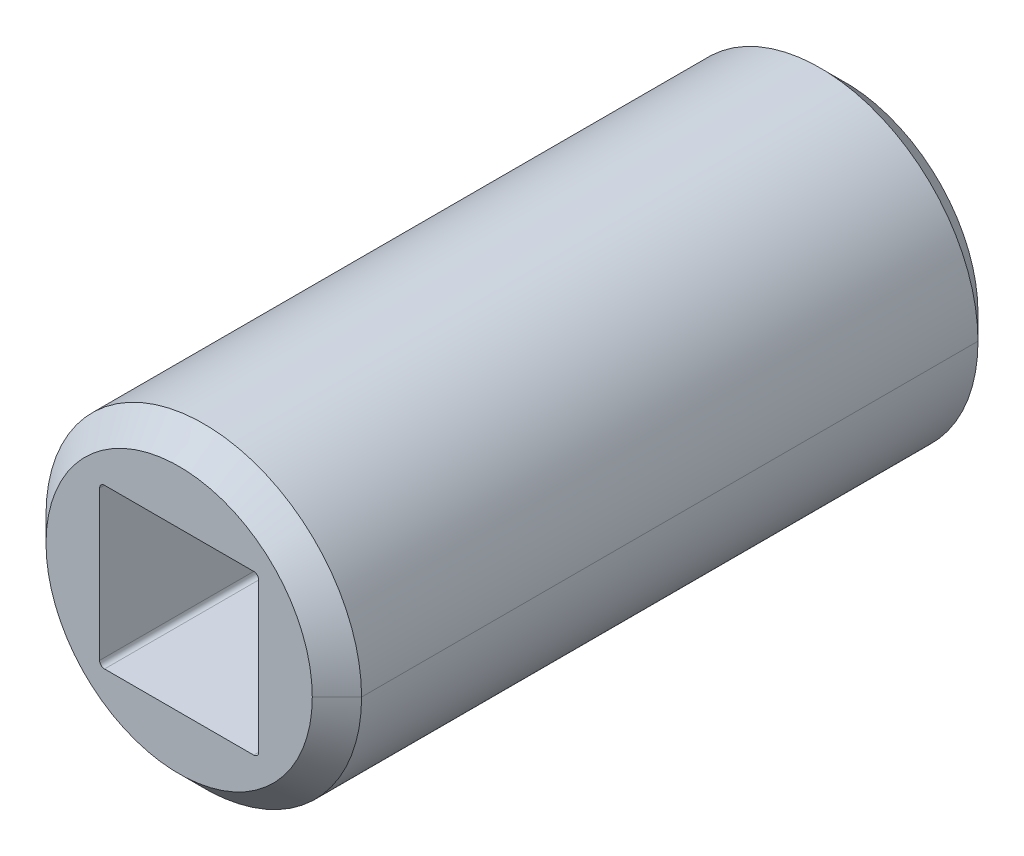
ISO-10303-21;
HEADER;
FILE_DESCRIPTION(('STEP AP214'),'2;1');
FILE_NAME('part.step','',(''),(''),'','','');
FILE_SCHEMA(('AUTOMOTIVE_DESIGN { 1 0 10303 214 1 1 1 1 }'));
ENDSEC;
DATA;
#1=APPLICATION_CONTEXT('core data for automotive mechanical design processes');
#2=APPLICATION_PROTOCOL_DEFINITION('international standard','automotive_design',2000,#1);
#3=PRODUCT_CONTEXT('',#1,'mechanical');
#4=PRODUCT('Part','Part','',(#3));
#5=PRODUCT_RELATED_PRODUCT_CATEGORY('part','',(#4));
#6=PRODUCT_DEFINITION_FORMATION('','',#4);
#7=PRODUCT_DEFINITION_CONTEXT('part definition',#1,'design');
#8=PRODUCT_DEFINITION('design','',#6,#7);
#9=PRODUCT_DEFINITION_SHAPE('','',#8);
#10=(LENGTH_UNIT() NAMED_UNIT(*) SI_UNIT(.MILLI.,.METRE.));
#11=(NAMED_UNIT(*) PLANE_ANGLE_UNIT() SI_UNIT($,.RADIAN.));
#12=(NAMED_UNIT(*) SI_UNIT($,.STERADIAN.) SOLID_ANGLE_UNIT());
#13=UNCERTAINTY_MEASURE_WITH_UNIT(LENGTH_MEASURE(1.E-05),#10,'distance_accuracy_value','');
#14=(GEOMETRIC_REPRESENTATION_CONTEXT(3) GLOBAL_UNCERTAINTY_ASSIGNED_CONTEXT((#13)) GLOBAL_UNIT_ASSIGNED_CONTEXT((#10,
#11,#12)) REPRESENTATION_CONTEXT('',''));
#15=CARTESIAN_POINT('',(0.,0.,0.));
#16=DIRECTION('',(0.,0.,1.));
#17=DIRECTION('',(1.,0.,0.));
#18=AXIS2_PLACEMENT_3D('',#15,#16,#17);
#19=CARTESIAN_POINT('',(0.,0.,6.75));
#20=DIRECTION('',(0.,0.,-1.));
#21=DIRECTION('',(-1.,0.,0.));
#22=AXIS2_PLACEMENT_3D('',#19,#20,#21);
#23=CONICAL_SURFACE('',#22,2.7,0.785398163397446);
#24=CARTESIAN_POINT('',(0.,0.,6.75));
#25=DIRECTION('',(0.,0.,1.));
#26=DIRECTION('',(1.,0.,0.));
#27=AXIS2_PLACEMENT_3D('',#24,#25,#26);
#28=CIRCLE('',#27,2.7);
#29=CARTESIAN_POINT('',(2.7,0.,6.75));
#30=VERTEX_POINT('',#29);
#31=CARTESIAN_POINT('',(-2.7,0.,6.75));
#32=VERTEX_POINT('',#31);
#33=EDGE_CURVE('E41',#30,#32,#28,.T.);
#34=ORIENTED_EDGE('',*,*,#33,.F.);
#35=DIRECTION('',(0.707106781186546,0.,-0.707106781186549));
#36=VECTOR('',#35,1.);
#37=CARTESIAN_POINT('',(2.7,0.,6.75));
#38=LINE('',#37,#36);
#39=CARTESIAN_POINT('',(3.2,0.,6.25));
#40=VERTEX_POINT('',#39);
#41=EDGE_CURVE('E10',#30,#40,#38,.T.);
#42=ORIENTED_EDGE('',*,*,#41,.T.);
#43=CARTESIAN_POINT('',(0.,0.,6.25));
#44=DIRECTION('',(0.,0.,-1.));
#45=DIRECTION('',(1.,0.,0.));
#46=AXIS2_PLACEMENT_3D('',#43,#44,#45);
#47=CIRCLE('',#46,3.2);
#48=CARTESIAN_POINT('',(-3.2,0.,6.25));
#49=VERTEX_POINT('',#48);
#50=EDGE_CURVE('E283',#49,#40,#47,.T.);
#51=ORIENTED_EDGE('',*,*,#50,.F.);
#52=DIRECTION('',(-0.707106781186546,0.,-0.707106781186549));
#53=VECTOR('',#52,1.);
#54=CARTESIAN_POINT('',(-2.7,0.,6.75));
#55=LINE('',#54,#53);
#56=EDGE_CURVE('E360',#32,#49,#55,.T.);
#57=ORIENTED_EDGE('',*,*,#56,.F.);
#58=EDGE_LOOP('',(#34,#42,#51,#57));
#59=FACE_BOUND('',#58,.T.);
#60=ADVANCED_FACE('F16',(#59),#23,.T.);
#61=CARTESIAN_POINT('',(0.,0.,-6.25));
#62=DIRECTION('',(0.,0.,1.));
#63=DIRECTION('',(1.,0.,0.));
#64=AXIS2_PLACEMENT_3D('',#61,#62,#63);
#65=CONICAL_SURFACE('',#64,3.2,0.78539816339745);
#66=CARTESIAN_POINT('',(0.,0.,-6.75));
#67=DIRECTION('',(0.,0.,-1.));
#68=DIRECTION('',(1.,0.,0.));
#69=AXIS2_PLACEMENT_3D('',#66,#67,#68);
#70=CIRCLE('',#69,2.7);
#71=CARTESIAN_POINT('',(-2.7,0.,-6.75));
#72=VERTEX_POINT('',#71);
#73=CARTESIAN_POINT('',(2.7,0.,-6.75));
#74=VERTEX_POINT('',#73);
#75=EDGE_CURVE('E254',#72,#74,#70,.T.);
#76=ORIENTED_EDGE('',*,*,#75,.F.);
#77=DIRECTION('',(-0.707106781186549,0.,0.707106781186546));
#78=VECTOR('',#77,1.);
#79=CARTESIAN_POINT('',(-3.2,0.,-6.25));
#80=LINE('',#79,#78);
#81=CARTESIAN_POINT('',(-3.2,0.,-6.25));
#82=VERTEX_POINT('',#81);
#83=EDGE_CURVE('E30',#72,#82,#80,.T.);
#84=ORIENTED_EDGE('',*,*,#83,.T.);
#85=CARTESIAN_POINT('',(0.,0.,-6.25));
#86=DIRECTION('',(0.,0.,1.));
#87=DIRECTION('',(1.,0.,0.));
#88=AXIS2_PLACEMENT_3D('',#85,#86,#87);
#89=CIRCLE('',#88,3.2);
#90=CARTESIAN_POINT('',(3.2,0.,-6.25));
#91=VERTEX_POINT('',#90);
#92=EDGE_CURVE('E285',#91,#82,#89,.T.);
#93=ORIENTED_EDGE('',*,*,#92,.F.);
#94=DIRECTION('',(0.707106781186549,0.,0.707106781186546));
#95=VECTOR('',#94,1.);
#96=CARTESIAN_POINT('',(3.2,0.,-6.25));
#97=LINE('',#96,#95);
#98=EDGE_CURVE('E352',#74,#91,#97,.T.);
#99=ORIENTED_EDGE('',*,*,#98,.F.);
#100=EDGE_LOOP('',(#76,#84,#93,#99));
#101=FACE_BOUND('',#100,.T.);
#102=ADVANCED_FACE('F849',(#101),#65,.T.);
#103=CARTESIAN_POINT('',(0.,0.,6.75));
#104=DIRECTION('',(0.,0.,-1.));
#105=DIRECTION('',(-1.,0.,0.));
#106=AXIS2_PLACEMENT_3D('',#103,#104,#105);
#107=CYLINDRICAL_SURFACE('',#106,3.2);
#108=ORIENTED_EDGE('',*,*,#50,.T.);
#109=DIRECTION('',(0.,0.,-1.));
#110=VECTOR('',#109,1.);
#111=CARTESIAN_POINT('',(3.2,0.,6.75));
#112=LINE('',#111,#110);
#113=EDGE_CURVE('E287',#40,#91,#112,.T.);
#114=ORIENTED_EDGE('',*,*,#113,.T.);
#115=ORIENTED_EDGE('',*,*,#92,.T.);
#116=DIRECTION('',(0.,0.,-1.));
#117=VECTOR('',#116,1.);
#118=CARTESIAN_POINT('',(-3.2,0.,6.75));
#119=LINE('',#118,#117);
#120=EDGE_CURVE('E298',#49,#82,#119,.T.);
#121=ORIENTED_EDGE('',*,*,#120,.F.);
#122=EDGE_LOOP('',(#108,#114,#115,#121));
#123=FACE_BOUND('',#122,.T.);
#124=ADVANCED_FACE('F846',(#123),#107,.T.);
#125=CARTESIAN_POINT('',(0.,0.,6.75));
#126=DIRECTION('',(0.,0.,-1.));
#127=DIRECTION('',(-1.,0.,0.));
#128=AXIS2_PLACEMENT_3D('',#125,#126,#127);
#129=CYLINDRICAL_SURFACE('',#128,1.5875);
#130=CARTESIAN_POINT('',(0.,0.,1.));
#131=DIRECTION('',(0.,0.,1.));
#132=DIRECTION('',(1.,0.,0.));
#133=AXIS2_PLACEMENT_3D('',#130,#131,#132);
#134=CIRCLE('',#133,1.5875);
#135=CARTESIAN_POINT('',(-1.5875,0.,1.));
#136=VERTEX_POINT('',#135);
#137=CARTESIAN_POINT('',(1.5875,0.,1.));
#138=VERTEX_POINT('',#137);
#139=EDGE_CURVE('E289',#136,#138,#134,.T.);
#140=ORIENTED_EDGE('',*,*,#139,.T.);
#141=DIRECTION('',(0.,0.,-1.));
#142=VECTOR('',#141,1.);
#143=CARTESIAN_POINT('',(1.5875,0.,6.75));
#144=LINE('',#143,#142);
#145=CARTESIAN_POINT('',(1.5875,0.,-1.));
#146=VERTEX_POINT('',#145);
#147=EDGE_CURVE('E306',#138,#146,#144,.T.);
#148=ORIENTED_EDGE('',*,*,#147,.T.);
#149=CARTESIAN_POINT('',(0.,0.,-1.));
#150=DIRECTION('',(0.,0.,-1.));
#151=DIRECTION('',(-1.,0.,0.));
#152=AXIS2_PLACEMENT_3D('',#149,#150,#151);
#153=CIRCLE('',#152,1.5875);
#154=CARTESIAN_POINT('',(-1.5875,0.,-1.));
#155=VERTEX_POINT('',#154);
#156=EDGE_CURVE('E301',#146,#155,#153,.T.);
#157=ORIENTED_EDGE('',*,*,#156,.T.);
#158=DIRECTION('',(0.,0.,-1.));
#159=VECTOR('',#158,1.);
#160=CARTESIAN_POINT('',(-1.5875,0.,6.75));
#161=LINE('',#160,#159);
#162=EDGE_CURVE('E349',#136,#155,#161,.T.);
#163=ORIENTED_EDGE('',*,*,#162,.F.);
#164=EDGE_LOOP('',(#140,#148,#157,#163));
#165=FACE_BOUND('',#164,.T.);
#166=ADVANCED_FACE('F810',(#165),#129,.F.);
#167=CARTESIAN_POINT('',(0.,0.,6.75));
#168=DIRECTION('',(0.,0.,-1.));
#169=DIRECTION('',(-1.,0.,0.));
#170=AXIS2_PLACEMENT_3D('',#167,#168,#169);
#171=CYLINDRICAL_SURFACE('',#170,1.5875);
#172=ORIENTED_EDGE('',*,*,#147,.F.);
#173=CARTESIAN_POINT('',(0.,0.,1.));
#174=DIRECTION('',(0.,0.,1.));
#175=DIRECTION('',(1.,0.,0.));
#176=AXIS2_PLACEMENT_3D('',#173,#174,#175);
#177=CIRCLE('',#176,1.5875);
#178=EDGE_CURVE('E310',#138,#136,#177,.T.);
#179=ORIENTED_EDGE('',*,*,#178,.T.);
#180=ORIENTED_EDGE('',*,*,#162,.T.);
#181=CARTESIAN_POINT('',(0.,0.,-1.));
#182=DIRECTION('',(0.,0.,-1.));
#183=DIRECTION('',(-1.,0.,0.));
#184=AXIS2_PLACEMENT_3D('',#181,#182,#183);
#185=CIRCLE('',#184,1.5875);
#186=EDGE_CURVE('E294',#155,#146,#185,.T.);
#187=ORIENTED_EDGE('',*,*,#186,.T.);
#188=EDGE_LOOP('',(#172,#179,#180,#187));
#189=FACE_BOUND('',#188,.T.);
#190=ADVANCED_FACE('F802',(#189),#171,.F.);
#191=CARTESIAN_POINT('',(0.,0.,6.75));
#192=DIRECTION('',(0.,0.,1.));
#193=DIRECTION('',(1.,0.,0.));
#194=AXIS2_PLACEMENT_3D('',#191,#192,#193);
#195=PLANE('',#194);
#196=CARTESIAN_POINT('',(0.,0.,6.75));
#197=DIRECTION('',(0.,0.,1.));
#198=DIRECTION('',(1.,0.,0.));
#199=AXIS2_PLACEMENT_3D('',#196,#197,#198);
#200=CIRCLE('',#199,2.7);
#201=EDGE_CURVE('E295',#32,#30,#200,.T.);
#202=ORIENTED_EDGE('',*,*,#201,.T.);
#203=ORIENTED_EDGE('',*,*,#33,.T.);
#204=EDGE_LOOP('',(#202,#203));
#205=FACE_BOUND('',#204,.T.);
#206=DIRECTION('',(0.,1.,0.));
#207=VECTOR('',#206,1.);
#208=CARTESIAN_POINT('',(1.6129,1.6129,6.75));
#209=LINE('',#208,#207);
#210=CARTESIAN_POINT('',(1.6129,-1.5129,6.75));
#211=VERTEX_POINT('',#210);
#212=CARTESIAN_POINT('',(1.6129,1.5129,6.75));
#213=VERTEX_POINT('',#212);
#214=EDGE_CURVE('E220',#211,#213,#209,.T.);
#215=ORIENTED_EDGE('',*,*,#214,.F.);
#216=CARTESIAN_POINT('',(1.5129,-1.5129,6.75));
#217=DIRECTION('',(0.,0.,-1.));
#218=DIRECTION('',(1.,0.,0.));
#219=AXIS2_PLACEMENT_3D('',#216,#217,#218);
#220=CIRCLE('',#219,0.1);
#221=CARTESIAN_POINT('',(1.5129,-1.6129,6.75));
#222=VERTEX_POINT('',#221);
#223=EDGE_CURVE('E330',#211,#222,#220,.T.);
#224=ORIENTED_EDGE('',*,*,#223,.T.);
#225=DIRECTION('',(1.,0.,0.));
#226=VECTOR('',#225,1.);
#227=CARTESIAN_POINT('',(-1.6129,-1.6129,6.75));
#228=LINE('',#227,#226);
#229=CARTESIAN_POINT('',(-1.5129,-1.6129,6.75));
#230=VERTEX_POINT('',#229);
#231=EDGE_CURVE('E230',#230,#222,#228,.T.);
#232=ORIENTED_EDGE('',*,*,#231,.F.);
#233=CARTESIAN_POINT('',(-1.5129,-1.5129,6.75));
#234=DIRECTION('',(0.,0.,-1.));
#235=DIRECTION('',(1.,0.,0.));
#236=AXIS2_PLACEMENT_3D('',#233,#234,#235);
#237=CIRCLE('',#236,0.1);
#238=CARTESIAN_POINT('',(-1.6129,-1.5129,6.75));
#239=VERTEX_POINT('',#238);
#240=EDGE_CURVE('E416',#230,#239,#237,.T.);
#241=ORIENTED_EDGE('',*,*,#240,.T.);
#242=DIRECTION('',(0.,-1.,0.));
#243=VECTOR('',#242,1.);
#244=CARTESIAN_POINT('',(-1.6129,1.6129,6.75));
#245=LINE('',#244,#243);
#246=CARTESIAN_POINT('',(-1.6129,1.5129,6.75));
#247=VERTEX_POINT('',#246);
#248=EDGE_CURVE('E401',#247,#239,#245,.T.);
#249=ORIENTED_EDGE('',*,*,#248,.F.);
#250=CARTESIAN_POINT('',(-1.5129,1.5129,6.75));
#251=DIRECTION('',(0.,0.,-1.));
#252=DIRECTION('',(1.,0.,0.));
#253=AXIS2_PLACEMENT_3D('',#250,#251,#252);
#254=CIRCLE('',#253,0.1);
#255=CARTESIAN_POINT('',(-1.5129,1.6129,6.75));
#256=VERTEX_POINT('',#255);
#257=EDGE_CURVE('E425',#247,#256,#254,.T.);
#258=ORIENTED_EDGE('',*,*,#257,.T.);
#259=DIRECTION('',(-1.,0.,0.));
#260=VECTOR('',#259,1.);
#261=CARTESIAN_POINT('',(-1.6129,1.6129,6.75));
#262=LINE('',#261,#260);
#263=CARTESIAN_POINT('',(1.5129,1.6129,6.75));
#264=VERTEX_POINT('',#263);
#265=EDGE_CURVE('E309',#264,#256,#262,.T.);
#266=ORIENTED_EDGE('',*,*,#265,.F.);
#267=CARTESIAN_POINT('',(1.5129,1.5129,6.75));
#268=DIRECTION('',(0.,0.,-1.));
#269=DIRECTION('',(1.,0.,0.));
#270=AXIS2_PLACEMENT_3D('',#267,#268,#269);
#271=CIRCLE('',#270,0.1);
#272=EDGE_CURVE('E435',#264,#213,#271,.T.);
#273=ORIENTED_EDGE('',*,*,#272,.T.);
#274=EDGE_LOOP('',(#215,#224,#232,#241,#249,#258,#266,#273));
#275=FACE_BOUND('',#274,.T.);
#276=ADVANCED_FACE('F808',(#205,#275),#195,.T.);
#277=CARTESIAN_POINT('',(0.,0.,-6.75));
#278=DIRECTION('',(0.,0.,1.));
#279=DIRECTION('',(1.,0.,0.));
#280=AXIS2_PLACEMENT_3D('',#277,#278,#279);
#281=PLANE('',#280);
#282=CARTESIAN_POINT('',(0.,0.,-6.75));
#283=DIRECTION('',(0.,0.,-1.));
#284=DIRECTION('',(1.,0.,0.));
#285=AXIS2_PLACEMENT_3D('',#282,#283,#284);
#286=CIRCLE('',#285,2.7);
#287=EDGE_CURVE('E414',#74,#72,#286,.T.);
#288=ORIENTED_EDGE('',*,*,#287,.T.);
#289=ORIENTED_EDGE('',*,*,#75,.T.);
#290=EDGE_LOOP('',(#288,#289));
#291=FACE_BOUND('',#290,.T.);
#292=DIRECTION('',(0.,-1.,0.));
#293=VECTOR('',#292,1.);
#294=CARTESIAN_POINT('',(-1.6129,1.6129,-6.75));
#295=LINE('',#294,#293);
#296=CARTESIAN_POINT('',(-1.6129,1.5129,-6.75));
#297=VERTEX_POINT('',#296);
#298=CARTESIAN_POINT('',(-1.6129,-1.5129,-6.75));
#299=VERTEX_POINT('',#298);
#300=EDGE_CURVE('E249',#297,#299,#295,.T.);
#301=ORIENTED_EDGE('',*,*,#300,.T.);
#302=CARTESIAN_POINT('',(-1.5129,-1.5129,-6.75));
#303=DIRECTION('',(0.,0.,1.));
#304=DIRECTION('',(1.,0.,0.));
#305=AXIS2_PLACEMENT_3D('',#302,#303,#304);
#306=CIRCLE('',#305,0.1);
#307=CARTESIAN_POINT('',(-1.5129,-1.6129,-6.75));
#308=VERTEX_POINT('',#307);
#309=EDGE_CURVE('E238',#299,#308,#306,.T.);
#310=ORIENTED_EDGE('',*,*,#309,.T.);
#311=DIRECTION('',(1.,0.,0.));
#312=VECTOR('',#311,1.);
#313=CARTESIAN_POINT('',(-1.6129,-1.6129,-6.75));
#314=LINE('',#313,#312);
#315=CARTESIAN_POINT('',(1.5129,-1.6129,-6.75));
#316=VERTEX_POINT('',#315);
#317=EDGE_CURVE('E246',#308,#316,#314,.T.);
#318=ORIENTED_EDGE('',*,*,#317,.T.);
#319=CARTESIAN_POINT('',(1.5129,-1.5129,-6.75));
#320=DIRECTION('',(0.,0.,1.));
#321=DIRECTION('',(1.,0.,0.));
#322=AXIS2_PLACEMENT_3D('',#319,#320,#321);
#323=CIRCLE('',#322,0.1);
#324=CARTESIAN_POINT('',(1.6129,-1.5129,-6.75));
#325=VERTEX_POINT('',#324);
#326=EDGE_CURVE('E327',#316,#325,#323,.T.);
#327=ORIENTED_EDGE('',*,*,#326,.T.);
#328=DIRECTION('',(0.,1.,0.));
#329=VECTOR('',#328,1.);
#330=CARTESIAN_POINT('',(1.6129,1.6129,-6.75));
#331=LINE('',#330,#329);
#332=CARTESIAN_POINT('',(1.6129,1.5129,-6.75));
#333=VERTEX_POINT('',#332);
#334=EDGE_CURVE('E335',#325,#333,#331,.T.);
#335=ORIENTED_EDGE('',*,*,#334,.T.);
#336=CARTESIAN_POINT('',(1.5129,1.5129,-6.75));
#337=DIRECTION('',(0.,0.,1.));
#338=DIRECTION('',(1.,0.,0.));
#339=AXIS2_PLACEMENT_3D('',#336,#337,#338);
#340=CIRCLE('',#339,0.1);
#341=CARTESIAN_POINT('',(1.5129,1.6129,-6.75));
#342=VERTEX_POINT('',#341);
#343=EDGE_CURVE('E20',#333,#342,#340,.T.);
#344=ORIENTED_EDGE('',*,*,#343,.T.);
#345=DIRECTION('',(-1.,0.,0.));
#346=VECTOR('',#345,1.);
#347=CARTESIAN_POINT('',(-1.6129,1.6129,-6.75));
#348=LINE('',#347,#346);
#349=CARTESIAN_POINT('',(-1.5129,1.6129,-6.75));
#350=VERTEX_POINT('',#349);
#351=EDGE_CURVE('E383',#342,#350,#348,.T.);
#352=ORIENTED_EDGE('',*,*,#351,.T.);
#353=CARTESIAN_POINT('',(-1.5129,1.5129,-6.75));
#354=DIRECTION('',(0.,0.,1.));
#355=DIRECTION('',(1.,0.,0.));
#356=AXIS2_PLACEMENT_3D('',#353,#354,#355);
#357=CIRCLE('',#356,0.1);
#358=EDGE_CURVE('E130',#350,#297,#357,.T.);
#359=ORIENTED_EDGE('',*,*,#358,.T.);
#360=EDGE_LOOP('',(#301,#310,#318,#327,#335,#344,#352,#359));
#361=FACE_BOUND('',#360,.T.);
#362=ADVANCED_FACE('F253',(#291,#361),#281,.F.);
#363=CARTESIAN_POINT('',(0.,0.,6.75));
#364=DIRECTION('',(0.,0.,-1.));
#365=DIRECTION('',(-1.,0.,0.));
#366=AXIS2_PLACEMENT_3D('',#363,#364,#365);
#367=CYLINDRICAL_SURFACE('',#366,3.2);
#368=ORIENTED_EDGE('',*,*,#113,.F.);
#369=CARTESIAN_POINT('',(0.,0.,6.25));
#370=DIRECTION('',(0.,0.,-1.));
#371=DIRECTION('',(1.,0.,0.));
#372=AXIS2_PLACEMENT_3D('',#369,#370,#371);
#373=CIRCLE('',#372,3.2);
#374=EDGE_CURVE('E305',#40,#49,#373,.T.);
#375=ORIENTED_EDGE('',*,*,#374,.T.);
#376=ORIENTED_EDGE('',*,*,#120,.T.);
#377=CARTESIAN_POINT('',(0.,0.,-6.25));
#378=DIRECTION('',(0.,0.,1.));
#379=DIRECTION('',(1.,0.,0.));
#380=AXIS2_PLACEMENT_3D('',#377,#378,#379);
#381=CIRCLE('',#380,3.2);
#382=EDGE_CURVE('E304',#82,#91,#381,.T.);
#383=ORIENTED_EDGE('',*,*,#382,.T.);
#384=EDGE_LOOP('',(#368,#375,#376,#383));
#385=FACE_BOUND('',#384,.T.);
#386=ADVANCED_FACE('F839',(#385),#367,.T.);
#387=CARTESIAN_POINT('',(1.6129,1.6129,-4.56197010950313));
#388=DIRECTION('',(1.,0.,0.));
#389=DIRECTION('',(0.,1.,0.));
#390=AXIS2_PLACEMENT_3D('',#387,#388,#389);
#391=PLANE('',#390);
#392=ORIENTED_EDGE('',*,*,#214,.T.);
#393=DIRECTION('',(0.,0.,-1.));
#394=VECTOR('',#393,1.);
#395=CARTESIAN_POINT('',(1.6129,1.5129,1.));
#396=LINE('',#395,#394);
#397=CARTESIAN_POINT('',(1.6129,1.5129,1.));
#398=VERTEX_POINT('',#397);
#399=EDGE_CURVE('E280',#213,#398,#396,.T.);
#400=ORIENTED_EDGE('',*,*,#399,.T.);
#401=DIRECTION('',(0.,-1.,0.));
#402=VECTOR('',#401,1.);
#403=CARTESIAN_POINT('',(1.6129,1.6129,1.));
#404=LINE('',#403,#402);
#405=CARTESIAN_POINT('',(1.6129,-1.5129,1.));
#406=VERTEX_POINT('',#405);
#407=EDGE_CURVE('E278',#398,#406,#404,.T.);
#408=ORIENTED_EDGE('',*,*,#407,.T.);
#409=DIRECTION('',(0.,0.,1.));
#410=VECTOR('',#409,1.);
#411=CARTESIAN_POINT('',(1.6129,-1.5129,6.75));
#412=LINE('',#411,#410);
#413=EDGE_CURVE('E318',#406,#211,#412,.T.);
#414=ORIENTED_EDGE('',*,*,#413,.T.);
#415=EDGE_LOOP('',(#392,#400,#408,#414));
#416=FACE_BOUND('',#415,.T.);
#417=ADVANCED_FACE('F836',(#416),#391,.F.);
#418=CARTESIAN_POINT('',(-1.6129,-1.6129,-4.56197010950313));
#419=DIRECTION('',(0.,-1.,0.));
#420=DIRECTION('',(0.,0.,-1.));
#421=AXIS2_PLACEMENT_3D('',#418,#419,#420);
#422=PLANE('',#421);
#423=ORIENTED_EDGE('',*,*,#231,.T.);
#424=DIRECTION('',(0.,0.,-1.));
#425=VECTOR('',#424,1.);
#426=CARTESIAN_POINT('',(1.5129,-1.6129,1.));
#427=LINE('',#426,#425);
#428=CARTESIAN_POINT('',(1.5129,-1.6129,1.));
#429=VERTEX_POINT('',#428);
#430=EDGE_CURVE('E403',#222,#429,#427,.T.);
#431=ORIENTED_EDGE('',*,*,#430,.T.);
#432=DIRECTION('',(-1.,0.,0.));
#433=VECTOR('',#432,1.);
#434=CARTESIAN_POINT('',(-1.6129,-1.6129,1.));
#435=LINE('',#434,#433);
#436=CARTESIAN_POINT('',(-1.5129,-1.6129,1.));
#437=VERTEX_POINT('',#436);
#438=EDGE_CURVE('E406',#429,#437,#435,.T.);
#439=ORIENTED_EDGE('',*,*,#438,.T.);
#440=DIRECTION('',(0.,0.,1.));
#441=VECTOR('',#440,1.);
#442=CARTESIAN_POINT('',(-1.5129,-1.6129,6.75));
#443=LINE('',#442,#441);
#444=EDGE_CURVE('E430',#437,#230,#443,.T.);
#445=ORIENTED_EDGE('',*,*,#444,.T.);
#446=EDGE_LOOP('',(#423,#431,#439,#445));
#447=FACE_BOUND('',#446,.T.);
#448=ADVANCED_FACE('F18',(#447),#422,.F.);
#449=CARTESIAN_POINT('',(-1.6129,1.6129,-4.56197010950313));
#450=DIRECTION('',(-1.,0.,0.));
#451=DIRECTION('',(0.,1.,0.));
#452=AXIS2_PLACEMENT_3D('',#449,#450,#451);
#453=PLANE('',#452);
#454=ORIENTED_EDGE('',*,*,#248,.T.);
#455=DIRECTION('',(0.,0.,-1.));
#456=VECTOR('',#455,1.);
#457=CARTESIAN_POINT('',(-1.6129,-1.5129,1.));
#458=LINE('',#457,#456);
#459=CARTESIAN_POINT('',(-1.6129,-1.5129,1.));
#460=VERTEX_POINT('',#459);
#461=EDGE_CURVE('E398',#239,#460,#458,.T.);
#462=ORIENTED_EDGE('',*,*,#461,.T.);
#463=DIRECTION('',(0.,1.,0.));
#464=VECTOR('',#463,1.);
#465=CARTESIAN_POINT('',(-1.6129,1.6129,1.));
#466=LINE('',#465,#464);
#467=CARTESIAN_POINT('',(-1.6129,1.5129,1.));
#468=VERTEX_POINT('',#467);
#469=EDGE_CURVE('E370',#460,#468,#466,.T.);
#470=ORIENTED_EDGE('',*,*,#469,.T.);
#471=DIRECTION('',(0.,0.,1.));
#472=VECTOR('',#471,1.);
#473=CARTESIAN_POINT('',(-1.6129,1.5129,6.75));
#474=LINE('',#473,#472);
#475=EDGE_CURVE('E361',#468,#247,#474,.T.);
#476=ORIENTED_EDGE('',*,*,#475,.T.);
#477=EDGE_LOOP('',(#454,#462,#470,#476));
#478=FACE_BOUND('',#477,.T.);
#479=ADVANCED_FACE('F711',(#478),#453,.F.);
#480=CARTESIAN_POINT('',(-1.6129,1.6129,-4.56197010950313));
#481=DIRECTION('',(0.,1.,0.));
#482=DIRECTION('',(1.,0.,0.));
#483=AXIS2_PLACEMENT_3D('',#480,#481,#482);
#484=PLANE('',#483);
#485=DIRECTION('',(1.,0.,0.));
#486=VECTOR('',#485,1.);
#487=CARTESIAN_POINT('',(-1.6129,1.6129,1.));
#488=LINE('',#487,#486);
#489=CARTESIAN_POINT('',(-1.5129,1.6129,1.));
#490=VERTEX_POINT('',#489);
#491=CARTESIAN_POINT('',(1.5129,1.6129,1.));
#492=VERTEX_POINT('',#491);
#493=EDGE_CURVE('E366',#490,#492,#488,.T.);
#494=ORIENTED_EDGE('',*,*,#493,.T.);
#495=DIRECTION('',(0.,0.,1.));
#496=VECTOR('',#495,1.);
#497=CARTESIAN_POINT('',(1.5129,1.6129,6.75));
#498=LINE('',#497,#496);
#499=EDGE_CURVE('E311',#492,#264,#498,.T.);
#500=ORIENTED_EDGE('',*,*,#499,.T.);
#501=ORIENTED_EDGE('',*,*,#265,.T.);
#502=DIRECTION('',(0.,0.,-1.));
#503=VECTOR('',#502,1.);
#504=CARTESIAN_POINT('',(-1.5129,1.6129,1.));
#505=LINE('',#504,#503);
#506=EDGE_CURVE('E314',#256,#490,#505,.T.);
#507=ORIENTED_EDGE('',*,*,#506,.T.);
#508=EDGE_LOOP('',(#494,#500,#501,#507));
#509=FACE_BOUND('',#508,.T.);
#510=ADVANCED_FACE('F706',(#509),#484,.F.);
#511=CARTESIAN_POINT('',(0.,0.,1.));
#512=DIRECTION('',(0.,0.,1.));
#513=DIRECTION('',(1.,0.,0.));
#514=AXIS2_PLACEMENT_3D('',#511,#512,#513);
#515=PLANE('',#514);
#516=ORIENTED_EDGE('',*,*,#407,.F.);
#517=CARTESIAN_POINT('',(1.5129,1.5129,1.));
#518=DIRECTION('',(0.,0.,1.));
#519=DIRECTION('',(1.,0.,0.));
#520=AXIS2_PLACEMENT_3D('',#517,#518,#519);
#521=CIRCLE('',#520,0.1);
#522=EDGE_CURVE('E391',#398,#492,#521,.T.);
#523=ORIENTED_EDGE('',*,*,#522,.T.);
#524=ORIENTED_EDGE('',*,*,#493,.F.);
#525=CARTESIAN_POINT('',(-1.5129,1.5129,1.));
#526=DIRECTION('',(0.,0.,1.));
#527=DIRECTION('',(1.,0.,0.));
#528=AXIS2_PLACEMENT_3D('',#525,#526,#527);
#529=CIRCLE('',#528,0.1);
#530=EDGE_CURVE('E336',#490,#468,#529,.T.);
#531=ORIENTED_EDGE('',*,*,#530,.T.);
#532=ORIENTED_EDGE('',*,*,#469,.F.);
#533=CARTESIAN_POINT('',(-1.5129,-1.5129,1.));
#534=DIRECTION('',(0.,0.,1.));
#535=DIRECTION('',(1.,0.,0.));
#536=AXIS2_PLACEMENT_3D('',#533,#534,#535);
#537=CIRCLE('',#536,0.1);
#538=EDGE_CURVE('E323',#460,#437,#537,.T.);
#539=ORIENTED_EDGE('',*,*,#538,.T.);
#540=ORIENTED_EDGE('',*,*,#438,.F.);
#541=CARTESIAN_POINT('',(1.5129,-1.5129,1.));
#542=DIRECTION('',(0.,0.,1.));
#543=DIRECTION('',(1.,0.,0.));
#544=AXIS2_PLACEMENT_3D('',#541,#542,#543);
#545=CIRCLE('',#544,0.1);
#546=EDGE_CURVE('E317',#429,#406,#545,.T.);
#547=ORIENTED_EDGE('',*,*,#546,.T.);
#548=EDGE_LOOP('',(#516,#523,#524,#531,#532,#539,#540,#547));
#549=FACE_BOUND('',#548,.T.);
#550=ORIENTED_EDGE('',*,*,#139,.F.);
#551=ORIENTED_EDGE('',*,*,#178,.F.);
#552=EDGE_LOOP('',(#550,#551));
#553=FACE_BOUND('',#552,.T.);
#554=ADVANCED_FACE('F709',(#549,#553),#515,.T.);
#555=CARTESIAN_POINT('',(1.6129,1.6129,4.56197010950313));
#556=DIRECTION('',(1.,0.,0.));
#557=DIRECTION('',(0.,1.,0.));
#558=AXIS2_PLACEMENT_3D('',#555,#556,#557);
#559=PLANE('',#558);
#560=DIRECTION('',(0.,-1.,0.));
#561=VECTOR('',#560,1.);
#562=CARTESIAN_POINT('',(1.6129,1.6129,-1.));
#563=LINE('',#562,#561);
#564=CARTESIAN_POINT('',(1.6129,1.5129,-1.));
#565=VERTEX_POINT('',#564);
#566=CARTESIAN_POINT('',(1.6129,-1.5129,-1.));
#567=VERTEX_POINT('',#566);
#568=EDGE_CURVE('E379',#565,#567,#563,.T.);
#569=ORIENTED_EDGE('',*,*,#568,.F.);
#570=DIRECTION('',(0.,0.,-1.));
#571=VECTOR('',#570,1.);
#572=CARTESIAN_POINT('',(1.6129,1.5129,-6.75));
#573=LINE('',#572,#571);
#574=EDGE_CURVE('E322',#565,#333,#573,.T.);
#575=ORIENTED_EDGE('',*,*,#574,.T.);
#576=ORIENTED_EDGE('',*,*,#334,.F.);
#577=DIRECTION('',(0.,0.,1.));
#578=VECTOR('',#577,1.);
#579=CARTESIAN_POINT('',(1.6129,-1.5129,-1.));
#580=LINE('',#579,#578);
#581=EDGE_CURVE('E350',#325,#567,#580,.T.);
#582=ORIENTED_EDGE('',*,*,#581,.T.);
#583=EDGE_LOOP('',(#569,#575,#576,#582));
#584=FACE_BOUND('',#583,.T.);
#585=ADVANCED_FACE('F493',(#584),#559,.F.);
#586=CARTESIAN_POINT('',(-1.6129,-1.6129,4.56197010950313));
#587=DIRECTION('',(0.,-1.,0.));
#588=DIRECTION('',(0.,0.,-1.));
#589=AXIS2_PLACEMENT_3D('',#586,#587,#588);
#590=PLANE('',#589);
#591=ORIENTED_EDGE('',*,*,#317,.F.);
#592=DIRECTION('',(0.,0.,1.));
#593=VECTOR('',#592,1.);
#594=CARTESIAN_POINT('',(-1.5129,-1.6129,-1.));
#595=LINE('',#594,#593);
#596=CARTESIAN_POINT('',(-1.5129,-1.6129,-1.));
#597=VERTEX_POINT('',#596);
#598=EDGE_CURVE('E244',#308,#597,#595,.T.);
#599=ORIENTED_EDGE('',*,*,#598,.T.);
#600=DIRECTION('',(-1.,0.,0.));
#601=VECTOR('',#600,1.);
#602=CARTESIAN_POINT('',(-1.6129,-1.6129,-1.));
#603=LINE('',#602,#601);
#604=CARTESIAN_POINT('',(1.5129,-1.6129,-1.));
#605=VERTEX_POINT('',#604);
#606=EDGE_CURVE('E359',#605,#597,#603,.T.);
#607=ORIENTED_EDGE('',*,*,#606,.F.);
#608=DIRECTION('',(0.,0.,-1.));
#609=VECTOR('',#608,1.);
#610=CARTESIAN_POINT('',(1.5129,-1.6129,-6.75));
#611=LINE('',#610,#609);
#612=EDGE_CURVE('E268',#605,#316,#611,.T.);
#613=ORIENTED_EDGE('',*,*,#612,.T.);
#614=EDGE_LOOP('',(#591,#599,#607,#613));
#615=FACE_BOUND('',#614,.T.);
#616=ADVANCED_FACE('F482',(#615),#590,.F.);
#617=CARTESIAN_POINT('',(-1.6129,1.6129,4.56197010950313));
#618=DIRECTION('',(-1.,0.,0.));
#619=DIRECTION('',(0.,1.,0.));
#620=AXIS2_PLACEMENT_3D('',#617,#618,#619);
#621=PLANE('',#620);
#622=ORIENTED_EDGE('',*,*,#300,.F.);
#623=DIRECTION('',(0.,0.,1.));
#624=VECTOR('',#623,1.);
#625=CARTESIAN_POINT('',(-1.6129,1.5129,-1.));
#626=LINE('',#625,#624);
#627=CARTESIAN_POINT('',(-1.6129,1.5129,-1.));
#628=VERTEX_POINT('',#627);
#629=EDGE_CURVE('E257',#297,#628,#626,.T.);
#630=ORIENTED_EDGE('',*,*,#629,.T.);
#631=DIRECTION('',(0.,1.,0.));
#632=VECTOR('',#631,1.);
#633=CARTESIAN_POINT('',(-1.6129,1.6129,-1.));
#634=LINE('',#633,#632);
#635=CARTESIAN_POINT('',(-1.6129,-1.5129,-1.));
#636=VERTEX_POINT('',#635);
#637=EDGE_CURVE('E256',#636,#628,#634,.T.);
#638=ORIENTED_EDGE('',*,*,#637,.F.);
#639=DIRECTION('',(0.,0.,-1.));
#640=VECTOR('',#639,1.);
#641=CARTESIAN_POINT('',(-1.6129,-1.5129,-6.75));
#642=LINE('',#641,#640);
#643=EDGE_CURVE('E245',#636,#299,#642,.T.);
#644=ORIENTED_EDGE('',*,*,#643,.T.);
#645=EDGE_LOOP('',(#622,#630,#638,#644));
#646=FACE_BOUND('',#645,.T.);
#647=ADVANCED_FACE('F260',(#646),#621,.F.);
#648=CARTESIAN_POINT('',(-1.6129,1.6129,4.56197010950313));
#649=DIRECTION('',(0.,1.,0.));
#650=DIRECTION('',(1.,0.,0.));
#651=AXIS2_PLACEMENT_3D('',#648,#649,#650);
#652=PLANE('',#651);
#653=ORIENTED_EDGE('',*,*,#351,.F.);
#654=DIRECTION('',(0.,0.,1.));
#655=VECTOR('',#654,1.);
#656=CARTESIAN_POINT('',(1.5129,1.6129,-1.));
#657=LINE('',#656,#655);
#658=CARTESIAN_POINT('',(1.5129,1.6129,-1.));
#659=VERTEX_POINT('',#658);
#660=EDGE_CURVE('E261',#342,#659,#657,.T.);
#661=ORIENTED_EDGE('',*,*,#660,.T.);
#662=DIRECTION('',(1.,0.,0.));
#663=VECTOR('',#662,1.);
#664=CARTESIAN_POINT('',(-1.6129,1.6129,-1.));
#665=LINE('',#664,#663);
#666=CARTESIAN_POINT('',(-1.5129,1.6129,-1.));
#667=VERTEX_POINT('',#666);
#668=EDGE_CURVE('E337',#667,#659,#665,.T.);
#669=ORIENTED_EDGE('',*,*,#668,.F.);
#670=DIRECTION('',(0.,0.,-1.));
#671=VECTOR('',#670,1.);
#672=CARTESIAN_POINT('',(-1.5129,1.6129,-6.75));
#673=LINE('',#672,#671);
#674=EDGE_CURVE('E275',#667,#350,#673,.T.);
#675=ORIENTED_EDGE('',*,*,#674,.T.);
#676=EDGE_LOOP('',(#653,#661,#669,#675));
#677=FACE_BOUND('',#676,.T.);
#678=ADVANCED_FACE('F723',(#677),#652,.F.);
#679=CARTESIAN_POINT('',(0.,0.,-1.));
#680=DIRECTION('',(0.,0.,-1.));
#681=DIRECTION('',(0.,-1.,0.));
#682=AXIS2_PLACEMENT_3D('',#679,#680,#681);
#683=PLANE('',#682);
#684=ORIENTED_EDGE('',*,*,#668,.T.);
#685=CARTESIAN_POINT('',(1.5129,1.5129,-1.));
#686=DIRECTION('',(0.,0.,-1.));
#687=DIRECTION('',(-1.,0.,0.));
#688=AXIS2_PLACEMENT_3D('',#685,#686,#687);
#689=CIRCLE('',#688,0.1);
#690=EDGE_CURVE('E340',#659,#565,#689,.T.);
#691=ORIENTED_EDGE('',*,*,#690,.T.);
#692=ORIENTED_EDGE('',*,*,#568,.T.);
#693=CARTESIAN_POINT('',(1.5129,-1.5129,-1.));
#694=DIRECTION('',(0.,0.,-1.));
#695=DIRECTION('',(-1.,0.,0.));
#696=AXIS2_PLACEMENT_3D('',#693,#694,#695);
#697=CIRCLE('',#696,0.1);
#698=EDGE_CURVE('E363',#567,#605,#697,.T.);
#699=ORIENTED_EDGE('',*,*,#698,.T.);
#700=ORIENTED_EDGE('',*,*,#606,.T.);
#701=CARTESIAN_POINT('',(-1.5129,-1.5129,-1.));
#702=DIRECTION('',(0.,0.,-1.));
#703=DIRECTION('',(-1.,0.,0.));
#704=AXIS2_PLACEMENT_3D('',#701,#702,#703);
#705=CIRCLE('',#704,0.1);
#706=EDGE_CURVE('E362',#597,#636,#705,.T.);
#707=ORIENTED_EDGE('',*,*,#706,.T.);
#708=ORIENTED_EDGE('',*,*,#637,.T.);
#709=CARTESIAN_POINT('',(-1.5129,1.5129,-1.));
#710=DIRECTION('',(0.,0.,-1.));
#711=DIRECTION('',(-1.,0.,0.));
#712=AXIS2_PLACEMENT_3D('',#709,#710,#711);
#713=CIRCLE('',#712,0.1);
#714=EDGE_CURVE('E357',#628,#667,#713,.T.);
#715=ORIENTED_EDGE('',*,*,#714,.T.);
#716=EDGE_LOOP('',(#684,#691,#692,#699,#700,#707,#708,#715));
#717=FACE_BOUND('',#716,.T.);
#718=ORIENTED_EDGE('',*,*,#186,.F.);
#719=ORIENTED_EDGE('',*,*,#156,.F.);
#720=EDGE_LOOP('',(#718,#719));
#721=FACE_BOUND('',#720,.T.);
#722=ADVANCED_FACE('F487',(#717,#721),#683,.T.);
#723=CARTESIAN_POINT('',(0.,0.,-6.25));
#724=DIRECTION('',(0.,0.,1.));
#725=DIRECTION('',(1.,0.,0.));
#726=AXIS2_PLACEMENT_3D('',#723,#724,#725);
#727=CONICAL_SURFACE('',#726,3.2,0.78539816339745);
#728=ORIENTED_EDGE('',*,*,#83,.F.);
#729=ORIENTED_EDGE('',*,*,#287,.F.);
#730=ORIENTED_EDGE('',*,*,#98,.T.);
#731=ORIENTED_EDGE('',*,*,#382,.F.);
#732=EDGE_LOOP('',(#728,#729,#730,#731));
#733=FACE_BOUND('',#732,.T.);
#734=ADVANCED_FACE('F770',(#733),#727,.T.);
#735=CARTESIAN_POINT('',(0.,0.,6.75));
#736=DIRECTION('',(0.,0.,-1.));
#737=DIRECTION('',(-1.,0.,0.));
#738=AXIS2_PLACEMENT_3D('',#735,#736,#737);
#739=CONICAL_SURFACE('',#738,2.7,0.785398163397446);
#740=ORIENTED_EDGE('',*,*,#41,.F.);
#741=ORIENTED_EDGE('',*,*,#201,.F.);
#742=ORIENTED_EDGE('',*,*,#56,.T.);
#743=ORIENTED_EDGE('',*,*,#374,.F.);
#744=EDGE_LOOP('',(#740,#741,#742,#743));
#745=FACE_BOUND('',#744,.T.);
#746=ADVANCED_FACE('F772',(#745),#739,.T.);
#747=CARTESIAN_POINT('',(1.5129,1.5129,-4.56197010950313));
#748=DIRECTION('',(0.,0.,-1.));
#749=DIRECTION('',(-1.,0.,0.));
#750=AXIS2_PLACEMENT_3D('',#747,#748,#749);
#751=CYLINDRICAL_SURFACE('',#750,0.1);
#752=ORIENTED_EDGE('',*,*,#522,.F.);
#753=ORIENTED_EDGE('',*,*,#399,.F.);
#754=ORIENTED_EDGE('',*,*,#272,.F.);
#755=ORIENTED_EDGE('',*,*,#499,.F.);
#756=EDGE_LOOP('',(#752,#753,#754,#755));
#757=FACE_BOUND('',#756,.T.);
#758=ADVANCED_FACE('F797',(#757),#751,.F.);
#759=CARTESIAN_POINT('',(1.5129,-1.5129,-4.56197010950313));
#760=DIRECTION('',(0.,0.,-1.));
#761=DIRECTION('',(-1.,0.,0.));
#762=AXIS2_PLACEMENT_3D('',#759,#760,#761);
#763=CYLINDRICAL_SURFACE('',#762,0.1);
#764=ORIENTED_EDGE('',*,*,#546,.F.);
#765=ORIENTED_EDGE('',*,*,#430,.F.);
#766=ORIENTED_EDGE('',*,*,#223,.F.);
#767=ORIENTED_EDGE('',*,*,#413,.F.);
#768=EDGE_LOOP('',(#764,#765,#766,#767));
#769=FACE_BOUND('',#768,.T.);
#770=ADVANCED_FACE('F780',(#769),#763,.F.);
#771=CARTESIAN_POINT('',(-1.5129,-1.5129,-4.56197010950313));
#772=DIRECTION('',(0.,0.,-1.));
#773=DIRECTION('',(-1.,0.,0.));
#774=AXIS2_PLACEMENT_3D('',#771,#772,#773);
#775=CYLINDRICAL_SURFACE('',#774,0.1);
#776=ORIENTED_EDGE('',*,*,#538,.F.);
#777=ORIENTED_EDGE('',*,*,#461,.F.);
#778=ORIENTED_EDGE('',*,*,#240,.F.);
#779=ORIENTED_EDGE('',*,*,#444,.F.);
#780=EDGE_LOOP('',(#776,#777,#778,#779));
#781=FACE_BOUND('',#780,.T.);
#782=ADVANCED_FACE('F754',(#781),#775,.F.);
#783=CARTESIAN_POINT('',(-1.5129,1.5129,-4.56197010950313));
#784=DIRECTION('',(0.,0.,-1.));
#785=DIRECTION('',(-1.,0.,0.));
#786=AXIS2_PLACEMENT_3D('',#783,#784,#785);
#787=CYLINDRICAL_SURFACE('',#786,0.1);
#788=ORIENTED_EDGE('',*,*,#530,.F.);
#789=ORIENTED_EDGE('',*,*,#506,.F.);
#790=ORIENTED_EDGE('',*,*,#257,.F.);
#791=ORIENTED_EDGE('',*,*,#475,.F.);
#792=EDGE_LOOP('',(#788,#789,#790,#791));
#793=FACE_BOUND('',#792,.T.);
#794=ADVANCED_FACE('F737',(#793),#787,.F.);
#795=CARTESIAN_POINT('',(1.5129,1.5129,4.56197010950313));
#796=DIRECTION('',(0.,0.,1.));
#797=DIRECTION('',(1.,0.,0.));
#798=AXIS2_PLACEMENT_3D('',#795,#796,#797);
#799=CYLINDRICAL_SURFACE('',#798,0.1);
#800=ORIENTED_EDGE('',*,*,#690,.F.);
#801=ORIENTED_EDGE('',*,*,#660,.F.);
#802=ORIENTED_EDGE('',*,*,#343,.F.);
#803=ORIENTED_EDGE('',*,*,#574,.F.);
#804=EDGE_LOOP('',(#800,#801,#802,#803));
#805=FACE_BOUND('',#804,.T.);
#806=ADVANCED_FACE('F733',(#805),#799,.F.);
#807=CARTESIAN_POINT('',(-1.5129,1.5129,4.56197010950313));
#808=DIRECTION('',(0.,0.,1.));
#809=DIRECTION('',(1.,0.,0.));
#810=AXIS2_PLACEMENT_3D('',#807,#808,#809);
#811=CYLINDRICAL_SURFACE('',#810,0.1);
#812=ORIENTED_EDGE('',*,*,#714,.F.);
#813=ORIENTED_EDGE('',*,*,#629,.F.);
#814=ORIENTED_EDGE('',*,*,#358,.F.);
#815=ORIENTED_EDGE('',*,*,#674,.F.);
#816=EDGE_LOOP('',(#812,#813,#814,#815));
#817=FACE_BOUND('',#816,.T.);
#818=ADVANCED_FACE('F740',(#817),#811,.F.);
#819=CARTESIAN_POINT('',(-1.5129,-1.5129,4.56197010950313));
#820=DIRECTION('',(0.,0.,1.));
#821=DIRECTION('',(1.,0.,0.));
#822=AXIS2_PLACEMENT_3D('',#819,#820,#821);
#823=CYLINDRICAL_SURFACE('',#822,0.1);
#824=ORIENTED_EDGE('',*,*,#706,.F.);
#825=ORIENTED_EDGE('',*,*,#598,.F.);
#826=ORIENTED_EDGE('',*,*,#309,.F.);
#827=ORIENTED_EDGE('',*,*,#643,.F.);
#828=EDGE_LOOP('',(#824,#825,#826,#827));
#829=FACE_BOUND('',#828,.T.);
#830=ADVANCED_FACE('F239',(#829),#823,.F.);
#831=CARTESIAN_POINT('',(1.5129,-1.5129,4.56197010950313));
#832=DIRECTION('',(0.,0.,1.));
#833=DIRECTION('',(1.,0.,0.));
#834=AXIS2_PLACEMENT_3D('',#831,#832,#833);
#835=CYLINDRICAL_SURFACE('',#834,0.1);
#836=ORIENTED_EDGE('',*,*,#698,.F.);
#837=ORIENTED_EDGE('',*,*,#581,.F.);
#838=ORIENTED_EDGE('',*,*,#326,.F.);
#839=ORIENTED_EDGE('',*,*,#612,.F.);
#840=EDGE_LOOP('',(#836,#837,#838,#839));
#841=FACE_BOUND('',#840,.T.);
#842=ADVANCED_FACE('F490',(#841),#835,.F.);
#843=CLOSED_SHELL('',(#60,#102,#124,#166,#190,#276,#362,#386,#417,#448,#479,#510,#554,#585,#616,
#647,#678,#722,#734,#746,#758,#770,#782,#794,#806,#818,#830,#842));
#844=MANIFOLD_SOLID_BREP('B1',#843);
#845=ADVANCED_BREP_SHAPE_REPRESENTATION('',(#18,#844),#14);
#846=SHAPE_DEFINITION_REPRESENTATION(#9,#845);
ENDSEC;
END-ISO-10303-21;
